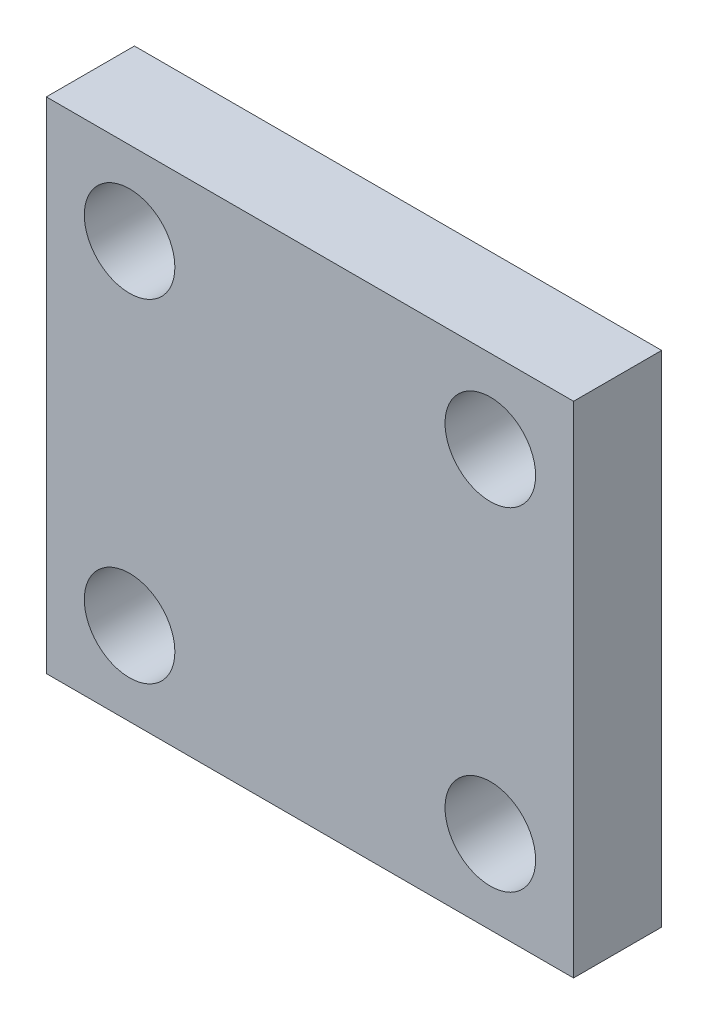
ISO-10303-21;
HEADER;
FILE_DESCRIPTION(('STEP AP214'),'2;1');
FILE_NAME('part.step','',(''),(''),'','','');
FILE_SCHEMA(('AUTOMOTIVE_DESIGN { 1 0 10303 214 1 1 1 1 }'));
ENDSEC;
DATA;
#1=APPLICATION_CONTEXT('core data for automotive mechanical design processes');
#2=APPLICATION_PROTOCOL_DEFINITION('international standard','automotive_design',2000,#1);
#3=PRODUCT_CONTEXT('',#1,'mechanical');
#4=PRODUCT('Part','Part','',(#3));
#5=PRODUCT_RELATED_PRODUCT_CATEGORY('part','',(#4));
#6=PRODUCT_DEFINITION_FORMATION('','',#4);
#7=PRODUCT_DEFINITION_CONTEXT('part definition',#1,'design');
#8=PRODUCT_DEFINITION('design','',#6,#7);
#9=PRODUCT_DEFINITION_SHAPE('','',#8);
#10=(LENGTH_UNIT() NAMED_UNIT(*) SI_UNIT(.MILLI.,.METRE.));
#11=(NAMED_UNIT(*) PLANE_ANGLE_UNIT() SI_UNIT($,.RADIAN.));
#12=(NAMED_UNIT(*) SI_UNIT($,.STERADIAN.) SOLID_ANGLE_UNIT());
#13=UNCERTAINTY_MEASURE_WITH_UNIT(LENGTH_MEASURE(1.E-05),#10,'distance_accuracy_value','');
#14=(GEOMETRIC_REPRESENTATION_CONTEXT(3) GLOBAL_UNCERTAINTY_ASSIGNED_CONTEXT((#13)) GLOBAL_UNIT_ASSIGNED_CONTEXT((#10,
#11,#12)) REPRESENTATION_CONTEXT('',''));
#15=CARTESIAN_POINT('',(0.,0.,0.));
#16=DIRECTION('',(0.,0.,1.));
#17=DIRECTION('',(1.,0.,0.));
#18=AXIS2_PLACEMENT_3D('',#15,#16,#17);
#19=CARTESIAN_POINT('',(0.,0.,6.35));
#20=DIRECTION('',(1.,0.,0.));
#21=DIRECTION('',(0.,1.,0.));
#22=AXIS2_PLACEMENT_3D('',#19,#20,#21);
#23=PLANE('',#22);
#24=DIRECTION('',(0.,-1.,0.));
#25=VECTOR('',#24,1.);
#26=CARTESIAN_POINT('',(0.,0.,0.));
#27=LINE('',#26,#25);
#28=CARTESIAN_POINT('',(0.,36.,0.));
#29=VERTEX_POINT('',#28);
#30=CARTESIAN_POINT('',(0.,0.,0.));
#31=VERTEX_POINT('',#30);
#32=EDGE_CURVE('E106',#29,#31,#27,.T.);
#33=ORIENTED_EDGE('',*,*,#32,.T.);
#34=DIRECTION('',(0.,0.,-1.));
#35=VECTOR('',#34,1.);
#36=CARTESIAN_POINT('',(0.,0.,6.35));
#37=LINE('',#36,#35);
#38=CARTESIAN_POINT('',(0.,0.,6.35));
#39=VERTEX_POINT('',#38);
#40=EDGE_CURVE('E11',#39,#31,#37,.T.);
#41=ORIENTED_EDGE('',*,*,#40,.F.);
#42=DIRECTION('',(0.,-1.,0.));
#43=VECTOR('',#42,1.);
#44=CARTESIAN_POINT('',(0.,0.,6.35));
#45=LINE('',#44,#43);
#46=CARTESIAN_POINT('',(0.,36.,6.35));
#47=VERTEX_POINT('',#46);
#48=EDGE_CURVE('E94',#47,#39,#45,.T.);
#49=ORIENTED_EDGE('',*,*,#48,.F.);
#50=DIRECTION('',(0.,0.,-1.));
#51=VECTOR('',#50,1.);
#52=CARTESIAN_POINT('',(0.,36.,6.35));
#53=LINE('',#52,#51);
#54=EDGE_CURVE('E102',#47,#29,#53,.T.);
#55=ORIENTED_EDGE('',*,*,#54,.T.);
#56=EDGE_LOOP('',(#33,#41,#49,#55));
#57=FACE_BOUND('',#56,.T.);
#58=ADVANCED_FACE('F43',(#57),#23,.F.);
#59=CARTESIAN_POINT('',(0.,0.,6.35));
#60=DIRECTION('',(0.,1.,0.));
#61=DIRECTION('',(0.,0.,1.));
#62=AXIS2_PLACEMENT_3D('',#59,#60,#61);
#63=PLANE('',#62);
#64=DIRECTION('',(1.,0.,0.));
#65=VECTOR('',#64,1.);
#66=CARTESIAN_POINT('',(0.,0.,0.));
#67=LINE('',#66,#65);
#68=CARTESIAN_POINT('',(38.,0.,0.));
#69=VERTEX_POINT('',#68);
#70=EDGE_CURVE('E98',#31,#69,#67,.T.);
#71=ORIENTED_EDGE('',*,*,#70,.T.);
#72=DIRECTION('',(0.,0.,-1.));
#73=VECTOR('',#72,1.);
#74=CARTESIAN_POINT('',(38.,0.,6.35));
#75=LINE('',#74,#73);
#76=CARTESIAN_POINT('',(38.,0.,6.35));
#77=VERTEX_POINT('',#76);
#78=EDGE_CURVE('E51',#77,#69,#75,.T.);
#79=ORIENTED_EDGE('',*,*,#78,.F.);
#80=DIRECTION('',(1.,0.,0.));
#81=VECTOR('',#80,1.);
#82=CARTESIAN_POINT('',(0.,0.,6.35));
#83=LINE('',#82,#81);
#84=EDGE_CURVE('E89',#39,#77,#83,.T.);
#85=ORIENTED_EDGE('',*,*,#84,.F.);
#86=ORIENTED_EDGE('',*,*,#40,.T.);
#87=EDGE_LOOP('',(#71,#79,#85,#86));
#88=FACE_BOUND('',#87,.T.);
#89=ADVANCED_FACE('F97',(#88),#63,.F.);
#90=CARTESIAN_POINT('',(38.,0.,6.35));
#91=DIRECTION('',(-1.,0.,0.));
#92=DIRECTION('',(0.,-1.,0.));
#93=AXIS2_PLACEMENT_3D('',#90,#91,#92);
#94=PLANE('',#93);
#95=DIRECTION('',(0.,1.,0.));
#96=VECTOR('',#95,1.);
#97=CARTESIAN_POINT('',(38.,0.,0.));
#98=LINE('',#97,#96);
#99=CARTESIAN_POINT('',(38.,36.,0.));
#100=VERTEX_POINT('',#99);
#101=EDGE_CURVE('E76',#69,#100,#98,.T.);
#102=ORIENTED_EDGE('',*,*,#101,.T.);
#103=DIRECTION('',(0.,0.,-1.));
#104=VECTOR('',#103,1.);
#105=CARTESIAN_POINT('',(38.,36.,6.35));
#106=LINE('',#105,#104);
#107=CARTESIAN_POINT('',(38.,36.,6.35));
#108=VERTEX_POINT('',#107);
#109=EDGE_CURVE('E99',#108,#100,#106,.T.);
#110=ORIENTED_EDGE('',*,*,#109,.F.);
#111=DIRECTION('',(0.,1.,0.));
#112=VECTOR('',#111,1.);
#113=CARTESIAN_POINT('',(38.,0.,6.35));
#114=LINE('',#113,#112);
#115=EDGE_CURVE('E92',#77,#108,#114,.T.);
#116=ORIENTED_EDGE('',*,*,#115,.F.);
#117=ORIENTED_EDGE('',*,*,#78,.T.);
#118=EDGE_LOOP('',(#102,#110,#116,#117));
#119=FACE_BOUND('',#118,.T.);
#120=ADVANCED_FACE('F100',(#119),#94,.F.);
#121=CARTESIAN_POINT('',(0.,36.,6.35));
#122=DIRECTION('',(0.,-1.,0.));
#123=DIRECTION('',(0.,0.,-1.));
#124=AXIS2_PLACEMENT_3D('',#121,#122,#123);
#125=PLANE('',#124);
#126=DIRECTION('',(-1.,0.,0.));
#127=VECTOR('',#126,1.);
#128=CARTESIAN_POINT('',(0.,36.,0.));
#129=LINE('',#128,#127);
#130=EDGE_CURVE('E82',#100,#29,#129,.T.);
#131=ORIENTED_EDGE('',*,*,#130,.T.);
#132=ORIENTED_EDGE('',*,*,#54,.F.);
#133=DIRECTION('',(-1.,0.,0.));
#134=VECTOR('',#133,1.);
#135=CARTESIAN_POINT('',(0.,36.,6.35));
#136=LINE('',#135,#134);
#137=EDGE_CURVE('E59',#108,#47,#136,.T.);
#138=ORIENTED_EDGE('',*,*,#137,.F.);
#139=ORIENTED_EDGE('',*,*,#109,.T.);
#140=EDGE_LOOP('',(#131,#132,#138,#139));
#141=FACE_BOUND('',#140,.T.);
#142=ADVANCED_FACE('F114',(#141),#125,.F.);
#143=CARTESIAN_POINT('',(0.,0.,6.35));
#144=DIRECTION('',(0.,0.,-1.));
#145=DIRECTION('',(-1.,0.,0.));
#146=AXIS2_PLACEMENT_3D('',#143,#144,#145);
#147=PLANE('',#146);
#148=CARTESIAN_POINT('',(32.,6.,6.35));
#149=DIRECTION('',(0.,0.,1.));
#150=DIRECTION('',(1.,0.,0.));
#151=AXIS2_PLACEMENT_3D('',#148,#149,#150);
#152=CIRCLE('',#151,3.2639);
#153=CARTESIAN_POINT('',(35.2639,6.,6.35));
#154=VERTEX_POINT('',#153);
#155=EDGE_CURVE('E140',#154,#154,#152,.T.);
#156=ORIENTED_EDGE('',*,*,#155,.F.);
#157=EDGE_LOOP('',(#156));
#158=FACE_BOUND('',#157,.T.);
#159=CARTESIAN_POINT('',(5.99999999999998,6.,6.35));
#160=DIRECTION('',(0.,0.,1.));
#161=DIRECTION('',(1.,0.,0.));
#162=AXIS2_PLACEMENT_3D('',#159,#160,#161);
#163=CIRCLE('',#162,3.2639);
#164=CARTESIAN_POINT('',(9.26389999999998,6.,6.35));
#165=VERTEX_POINT('',#164);
#166=EDGE_CURVE('E134',#165,#165,#163,.T.);
#167=ORIENTED_EDGE('',*,*,#166,.F.);
#168=EDGE_LOOP('',(#167));
#169=FACE_BOUND('',#168,.T.);
#170=CARTESIAN_POINT('',(32.,30.,6.35));
#171=DIRECTION('',(0.,0.,1.));
#172=DIRECTION('',(1.,0.,0.));
#173=AXIS2_PLACEMENT_3D('',#170,#171,#172);
#174=CIRCLE('',#173,3.2639);
#175=CARTESIAN_POINT('',(35.2639,30.,6.35));
#176=VERTEX_POINT('',#175);
#177=EDGE_CURVE('E128',#176,#176,#174,.T.);
#178=ORIENTED_EDGE('',*,*,#177,.F.);
#179=EDGE_LOOP('',(#178));
#180=FACE_BOUND('',#179,.T.);
#181=CARTESIAN_POINT('',(5.99999999999998,30.,6.35));
#182=DIRECTION('',(0.,0.,1.));
#183=DIRECTION('',(1.,0.,0.));
#184=AXIS2_PLACEMENT_3D('',#181,#182,#183);
#185=CIRCLE('',#184,3.2639);
#186=CARTESIAN_POINT('',(9.26389999999998,30.,6.35));
#187=VERTEX_POINT('',#186);
#188=EDGE_CURVE('E122',#187,#187,#185,.T.);
#189=ORIENTED_EDGE('',*,*,#188,.F.);
#190=EDGE_LOOP('',(#189));
#191=FACE_BOUND('',#190,.T.);
#192=ORIENTED_EDGE('',*,*,#48,.T.);
#193=ORIENTED_EDGE('',*,*,#84,.T.);
#194=ORIENTED_EDGE('',*,*,#115,.T.);
#195=ORIENTED_EDGE('',*,*,#137,.T.);
#196=EDGE_LOOP('',(#192,#193,#194,#195));
#197=FACE_BOUND('',#196,.T.);
#198=ADVANCED_FACE('F90',(#158,#169,#180,#191,#197),#147,.F.);
#199=CARTESIAN_POINT('',(0.,0.,0.));
#200=DIRECTION('',(0.,0.,-1.));
#201=DIRECTION('',(-1.,0.,0.));
#202=AXIS2_PLACEMENT_3D('',#199,#200,#201);
#203=PLANE('',#202);
#204=CARTESIAN_POINT('',(32.,6.,0.));
#205=DIRECTION('',(0.,0.,1.));
#206=DIRECTION('',(1.,0.,0.));
#207=AXIS2_PLACEMENT_3D('',#204,#205,#206);
#208=CIRCLE('',#207,3.2639);
#209=CARTESIAN_POINT('',(35.2639,6.,0.));
#210=VERTEX_POINT('',#209);
#211=EDGE_CURVE('E137',#210,#210,#208,.T.);
#212=ORIENTED_EDGE('',*,*,#211,.T.);
#213=EDGE_LOOP('',(#212));
#214=FACE_BOUND('',#213,.T.);
#215=CARTESIAN_POINT('',(5.99999999999998,6.,0.));
#216=DIRECTION('',(0.,0.,1.));
#217=DIRECTION('',(1.,0.,0.));
#218=AXIS2_PLACEMENT_3D('',#215,#216,#217);
#219=CIRCLE('',#218,3.2639);
#220=CARTESIAN_POINT('',(9.26389999999998,6.,0.));
#221=VERTEX_POINT('',#220);
#222=EDGE_CURVE('E131',#221,#221,#219,.T.);
#223=ORIENTED_EDGE('',*,*,#222,.T.);
#224=EDGE_LOOP('',(#223));
#225=FACE_BOUND('',#224,.T.);
#226=CARTESIAN_POINT('',(32.,30.,0.));
#227=DIRECTION('',(0.,0.,1.));
#228=DIRECTION('',(1.,0.,0.));
#229=AXIS2_PLACEMENT_3D('',#226,#227,#228);
#230=CIRCLE('',#229,3.2639);
#231=CARTESIAN_POINT('',(35.2639,30.,0.));
#232=VERTEX_POINT('',#231);
#233=EDGE_CURVE('E125',#232,#232,#230,.T.);
#234=ORIENTED_EDGE('',*,*,#233,.T.);
#235=EDGE_LOOP('',(#234));
#236=FACE_BOUND('',#235,.T.);
#237=CARTESIAN_POINT('',(5.99999999999998,30.,0.));
#238=DIRECTION('',(0.,0.,1.));
#239=DIRECTION('',(1.,0.,0.));
#240=AXIS2_PLACEMENT_3D('',#237,#238,#239);
#241=CIRCLE('',#240,3.2639);
#242=CARTESIAN_POINT('',(9.26389999999998,30.,0.));
#243=VERTEX_POINT('',#242);
#244=EDGE_CURVE('E109',#243,#243,#241,.T.);
#245=ORIENTED_EDGE('',*,*,#244,.T.);
#246=EDGE_LOOP('',(#245));
#247=FACE_BOUND('',#246,.T.);
#248=ORIENTED_EDGE('',*,*,#32,.F.);
#249=ORIENTED_EDGE('',*,*,#130,.F.);
#250=ORIENTED_EDGE('',*,*,#101,.F.);
#251=ORIENTED_EDGE('',*,*,#70,.F.);
#252=EDGE_LOOP('',(#248,#249,#250,#251));
#253=FACE_BOUND('',#252,.T.);
#254=ADVANCED_FACE('F117',(#214,#225,#236,#247,#253),#203,.T.);
#255=CARTESIAN_POINT('',(5.99999999999998,30.,6.35));
#256=DIRECTION('',(0.,0.,1.));
#257=DIRECTION('',(1.,0.,0.));
#258=AXIS2_PLACEMENT_3D('',#255,#256,#257);
#259=CYLINDRICAL_SURFACE('',#258,3.2639);
#260=ORIENTED_EDGE('',*,*,#244,.F.);
#261=EDGE_LOOP('',(#260));
#262=FACE_BOUND('',#261,.T.);
#263=ORIENTED_EDGE('',*,*,#188,.T.);
#264=EDGE_LOOP('',(#263));
#265=FACE_BOUND('',#264,.T.);
#266=ADVANCED_FACE('F155',(#262,#265),#259,.F.);
#267=CARTESIAN_POINT('',(32.,30.,6.35));
#268=DIRECTION('',(0.,0.,1.));
#269=DIRECTION('',(1.,0.,0.));
#270=AXIS2_PLACEMENT_3D('',#267,#268,#269);
#271=CYLINDRICAL_SURFACE('',#270,3.2639);
#272=ORIENTED_EDGE('',*,*,#233,.F.);
#273=EDGE_LOOP('',(#272));
#274=FACE_BOUND('',#273,.T.);
#275=ORIENTED_EDGE('',*,*,#177,.T.);
#276=EDGE_LOOP('',(#275));
#277=FACE_BOUND('',#276,.T.);
#278=ADVANCED_FACE('F157',(#274,#277),#271,.F.);
#279=CARTESIAN_POINT('',(5.99999999999998,6.,6.35));
#280=DIRECTION('',(0.,0.,1.));
#281=DIRECTION('',(1.,0.,0.));
#282=AXIS2_PLACEMENT_3D('',#279,#280,#281);
#283=CYLINDRICAL_SURFACE('',#282,3.2639);
#284=ORIENTED_EDGE('',*,*,#222,.F.);
#285=EDGE_LOOP('',(#284));
#286=FACE_BOUND('',#285,.T.);
#287=ORIENTED_EDGE('',*,*,#166,.T.);
#288=EDGE_LOOP('',(#287));
#289=FACE_BOUND('',#288,.T.);
#290=ADVANCED_FACE('F164',(#286,#289),#283,.F.);
#291=CARTESIAN_POINT('',(32.,6.,6.35));
#292=DIRECTION('',(0.,0.,1.));
#293=DIRECTION('',(1.,0.,0.));
#294=AXIS2_PLACEMENT_3D('',#291,#292,#293);
#295=CYLINDRICAL_SURFACE('',#294,3.2639);
#296=ORIENTED_EDGE('',*,*,#211,.F.);
#297=EDGE_LOOP('',(#296));
#298=FACE_BOUND('',#297,.T.);
#299=ORIENTED_EDGE('',*,*,#155,.T.);
#300=EDGE_LOOP('',(#299));
#301=FACE_BOUND('',#300,.T.);
#302=ADVANCED_FACE('F144',(#298,#301),#295,.F.);
#303=CLOSED_SHELL('',(#58,#89,#120,#142,#198,#254,#266,#278,#290,#302));
#304=MANIFOLD_SOLID_BREP('B2',#303);
#305=ADVANCED_BREP_SHAPE_REPRESENTATION('',(#18,#304),#14);
#306=SHAPE_DEFINITION_REPRESENTATION(#9,#305);
ENDSEC;
END-ISO-10303-21;
